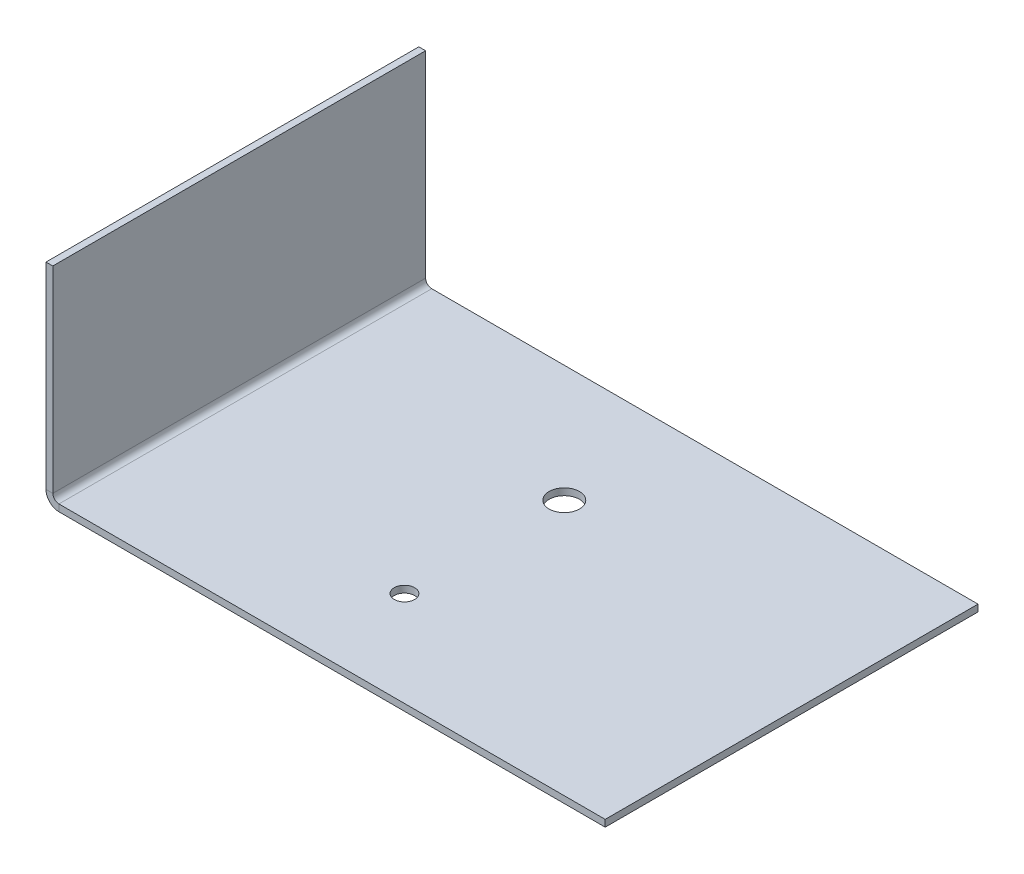
ISO-10303-21;
HEADER;
FILE_DESCRIPTION(('STEP AP214'),'2;1');
FILE_NAME('part.step','',(''),(''),'','','');
FILE_SCHEMA(('AUTOMOTIVE_DESIGN { 1 0 10303 214 1 1 1 1 }'));
ENDSEC;
DATA;
#1=APPLICATION_CONTEXT('core data for automotive mechanical design processes');
#2=APPLICATION_PROTOCOL_DEFINITION('international standard','automotive_design',2000,#1);
#3=PRODUCT_CONTEXT('',#1,'mechanical');
#4=PRODUCT('Part','Part','',(#3));
#5=PRODUCT_RELATED_PRODUCT_CATEGORY('part','',(#4));
#6=PRODUCT_DEFINITION_FORMATION('','',#4);
#7=PRODUCT_DEFINITION_CONTEXT('part definition',#1,'design');
#8=PRODUCT_DEFINITION('design','',#6,#7);
#9=PRODUCT_DEFINITION_SHAPE('','',#8);
#10=(LENGTH_UNIT() NAMED_UNIT(*) SI_UNIT(.MILLI.,.METRE.));
#11=(NAMED_UNIT(*) PLANE_ANGLE_UNIT() SI_UNIT($,.RADIAN.));
#12=(NAMED_UNIT(*) SI_UNIT($,.STERADIAN.) SOLID_ANGLE_UNIT());
#13=UNCERTAINTY_MEASURE_WITH_UNIT(LENGTH_MEASURE(1.E-05),#10,'distance_accuracy_value','');
#14=(GEOMETRIC_REPRESENTATION_CONTEXT(3) GLOBAL_UNCERTAINTY_ASSIGNED_CONTEXT((#13)) GLOBAL_UNIT_ASSIGNED_CONTEXT((#10,
#11,#12)) REPRESENTATION_CONTEXT('',''));
#15=CARTESIAN_POINT('',(0.,0.,0.));
#16=DIRECTION('',(0.,0.,1.));
#17=DIRECTION('',(1.,0.,0.));
#18=AXIS2_PLACEMENT_3D('',#15,#16,#17);
#19=CARTESIAN_POINT('',(0.,-1.8542,0.));
#20=DIRECTION('',(0.,0.,1.));
#21=DIRECTION('',(1.,0.,0.));
#22=AXIS2_PLACEMENT_3D('',#19,#20,#21);
#23=PLANE('',#22);
#24=DIRECTION('',(1.,0.,0.));
#25=VECTOR('',#24,1.);
#26=CARTESIAN_POINT('',(0.,0.,0.));
#27=LINE('',#26,#25);
#28=CARTESIAN_POINT('',(3.51789999999999,0.,0.));
#29=VERTEX_POINT('',#28);
#30=CARTESIAN_POINT('',(152.4,0.,0.));
#31=VERTEX_POINT('',#30);
#32=EDGE_CURVE('E105',#29,#31,#27,.T.);
#33=ORIENTED_EDGE('',*,*,#32,.F.);
#34=DIRECTION('',(0.,-1.,0.));
#35=VECTOR('',#34,1.);
#36=CARTESIAN_POINT('',(3.51789999999999,0.,0.));
#37=LINE('',#36,#35);
#38=CARTESIAN_POINT('',(3.51789999999999,-1.8542,0.));
#39=VERTEX_POINT('',#38);
#40=EDGE_CURVE('E118',#29,#39,#37,.T.);
#41=ORIENTED_EDGE('',*,*,#40,.T.);
#42=DIRECTION('',(1.,0.,0.));
#43=VECTOR('',#42,1.);
#44=CARTESIAN_POINT('',(0.,-1.8542,0.));
#45=LINE('',#44,#43);
#46=CARTESIAN_POINT('',(152.4,-1.8542,0.));
#47=VERTEX_POINT('',#46);
#48=EDGE_CURVE('E110',#39,#47,#45,.T.);
#49=ORIENTED_EDGE('',*,*,#48,.T.);
#50=DIRECTION('',(0.,1.,0.));
#51=VECTOR('',#50,1.);
#52=CARTESIAN_POINT('',(152.4,-1.8542,0.));
#53=LINE('',#52,#51);
#54=EDGE_CURVE('E60',#47,#31,#53,.T.);
#55=ORIENTED_EDGE('',*,*,#54,.T.);
#56=EDGE_LOOP('',(#33,#41,#49,#55));
#57=FACE_BOUND('',#56,.T.);
#58=ADVANCED_FACE('F57',(#57),#23,.T.);
#59=CARTESIAN_POINT('',(0.,-1.8542,0.));
#60=DIRECTION('',(0.,-1.,0.));
#61=DIRECTION('',(0.,0.,-1.));
#62=AXIS2_PLACEMENT_3D('',#59,#60,#61);
#63=PLANE('',#62);
#64=CARTESIAN_POINT('',(71.5155165915462,-1.8542,-69.7384503067724));
#65=DIRECTION('',(0.,1.,0.));
#66=DIRECTION('',(0.,0.,1.));
#67=AXIS2_PLACEMENT_3D('',#64,#65,#66);
#68=CIRCLE('',#67,4.14137650019472);
#69=CARTESIAN_POINT('',(71.5155165915462,-1.8542,-65.5970738065777));
#70=VERTEX_POINT('',#69);
#71=EDGE_CURVE('E179',#70,#70,#68,.T.);
#72=ORIENTED_EDGE('',*,*,#71,.T.);
#73=EDGE_LOOP('',(#72));
#74=FACE_BOUND('',#73,.T.);
#75=CARTESIAN_POINT('',(71.7639107741093,-1.8542,-25.927752689995));
#76=DIRECTION('',(0.,-1.,0.));
#77=DIRECTION('',(0.,0.,-1.));
#78=AXIS2_PLACEMENT_3D('',#75,#76,#77);
#79=CIRCLE('',#78,2.7813);
#80=CARTESIAN_POINT('',(71.7639107741093,-1.8542,-28.709052689995));
#81=VERTEX_POINT('',#80);
#82=EDGE_CURVE('E143',#81,#81,#79,.T.);
#83=ORIENTED_EDGE('',*,*,#82,.F.);
#84=EDGE_LOOP('',(#83));
#85=FACE_BOUND('',#84,.T.);
#86=ORIENTED_EDGE('',*,*,#48,.F.);
#87=DIRECTION('',(0.,0.,1.));
#88=VECTOR('',#87,1.);
#89=CARTESIAN_POINT('',(3.51789999999999,-1.8542,0.));
#90=LINE('',#89,#88);
#91=CARTESIAN_POINT('',(3.51789999999999,-1.8542,-101.6));
#92=VERTEX_POINT('',#91);
#93=EDGE_CURVE('E135',#39,#92,#90,.F.);
#94=ORIENTED_EDGE('',*,*,#93,.T.);
#95=DIRECTION('',(-1.,0.,0.));
#96=VECTOR('',#95,1.);
#97=CARTESIAN_POINT('',(0.,-1.8542,-101.6));
#98=LINE('',#97,#96);
#99=CARTESIAN_POINT('',(152.4,-1.8542,-101.6));
#100=VERTEX_POINT('',#99);
#101=EDGE_CURVE('E115',#100,#92,#98,.T.);
#102=ORIENTED_EDGE('',*,*,#101,.F.);
#103=DIRECTION('',(0.,0.,-1.));
#104=VECTOR('',#103,1.);
#105=CARTESIAN_POINT('',(152.4,-1.8542,0.));
#106=LINE('',#105,#104);
#107=EDGE_CURVE('E95',#47,#100,#106,.T.);
#108=ORIENTED_EDGE('',*,*,#107,.F.);
#109=EDGE_LOOP('',(#86,#94,#102,#108));
#110=FACE_BOUND('',#109,.T.);
#111=ADVANCED_FACE('F186',(#74,#85,#110),#63,.T.);
#112=CARTESIAN_POINT('',(0.,0.,0.));
#113=DIRECTION('',(0.,-1.,0.));
#114=DIRECTION('',(0.,0.,-1.));
#115=AXIS2_PLACEMENT_3D('',#112,#113,#114);
#116=PLANE('',#115);
#117=CARTESIAN_POINT('',(71.5155165915462,0.,-69.7384503067724));
#118=DIRECTION('',(0.,1.,0.));
#119=DIRECTION('',(0.,0.,1.));
#120=AXIS2_PLACEMENT_3D('',#117,#118,#119);
#121=CIRCLE('',#120,4.14137650019472);
#122=CARTESIAN_POINT('',(71.5155165915462,0.,-65.5970738065777));
#123=VERTEX_POINT('',#122);
#124=EDGE_CURVE('E180',#123,#123,#121,.T.);
#125=ORIENTED_EDGE('',*,*,#124,.F.);
#126=EDGE_LOOP('',(#125));
#127=FACE_BOUND('',#126,.T.);
#128=CARTESIAN_POINT('',(71.7639107741093,0.,-25.927752689995));
#129=DIRECTION('',(0.,1.,0.));
#130=DIRECTION('',(0.,0.,1.));
#131=AXIS2_PLACEMENT_3D('',#128,#129,#130);
#132=CIRCLE('',#131,2.7813);
#133=CARTESIAN_POINT('',(71.7639107741093,0.,-23.146452689995));
#134=VERTEX_POINT('',#133);
#135=EDGE_CURVE('E176',#134,#134,#132,.T.);
#136=ORIENTED_EDGE('',*,*,#135,.F.);
#137=EDGE_LOOP('',(#136));
#138=FACE_BOUND('',#137,.T.);
#139=DIRECTION('',(0.,0.,1.));
#140=VECTOR('',#139,1.);
#141=CARTESIAN_POINT('',(3.51789999999999,0.,0.));
#142=LINE('',#141,#140);
#143=CARTESIAN_POINT('',(3.51789999999999,0.,-101.6));
#144=VERTEX_POINT('',#143);
#145=EDGE_CURVE('E125',#29,#144,#142,.F.);
#146=ORIENTED_EDGE('',*,*,#145,.F.);
#147=ORIENTED_EDGE('',*,*,#32,.T.);
#148=DIRECTION('',(0.,0.,-1.));
#149=VECTOR('',#148,1.);
#150=CARTESIAN_POINT('',(152.4,0.,0.));
#151=LINE('',#150,#149);
#152=CARTESIAN_POINT('',(152.4,0.,-101.6));
#153=VERTEX_POINT('',#152);
#154=EDGE_CURVE('E93',#31,#153,#151,.T.);
#155=ORIENTED_EDGE('',*,*,#154,.T.);
#156=DIRECTION('',(-1.,0.,0.));
#157=VECTOR('',#156,1.);
#158=CARTESIAN_POINT('',(0.,0.,-101.6));
#159=LINE('',#158,#157);
#160=EDGE_CURVE('E102',#153,#144,#159,.T.);
#161=ORIENTED_EDGE('',*,*,#160,.T.);
#162=EDGE_LOOP('',(#146,#147,#155,#161));
#163=FACE_BOUND('',#162,.T.);
#164=ADVANCED_FACE('F100',(#127,#138,#163),#116,.F.);
#165=CARTESIAN_POINT('',(0.,-1.8542,-101.6));
#166=DIRECTION('',(0.,0.,-1.));
#167=DIRECTION('',(-1.,0.,0.));
#168=AXIS2_PLACEMENT_3D('',#165,#166,#167);
#169=PLANE('',#168);
#170=DIRECTION('',(0.,-1.,0.));
#171=VECTOR('',#170,1.);
#172=CARTESIAN_POINT('',(3.51789999999999,0.,-101.6));
#173=LINE('',#172,#171);
#174=EDGE_CURVE('E109',#144,#92,#173,.T.);
#175=ORIENTED_EDGE('',*,*,#174,.F.);
#176=ORIENTED_EDGE('',*,*,#160,.F.);
#177=DIRECTION('',(0.,1.,0.));
#178=VECTOR('',#177,1.);
#179=CARTESIAN_POINT('',(152.4,-1.8542,-101.6));
#180=LINE('',#179,#178);
#181=EDGE_CURVE('E13',#100,#153,#180,.T.);
#182=ORIENTED_EDGE('',*,*,#181,.F.);
#183=ORIENTED_EDGE('',*,*,#101,.T.);
#184=EDGE_LOOP('',(#175,#176,#182,#183));
#185=FACE_BOUND('',#184,.T.);
#186=ADVANCED_FACE('F108',(#185),#169,.T.);
#187=CARTESIAN_POINT('',(152.4,-1.8542,0.));
#188=DIRECTION('',(1.,0.,0.));
#189=DIRECTION('',(0.,0.,-1.));
#190=AXIS2_PLACEMENT_3D('',#187,#188,#189);
#191=PLANE('',#190);
#192=ORIENTED_EDGE('',*,*,#154,.F.);
#193=ORIENTED_EDGE('',*,*,#54,.F.);
#194=ORIENTED_EDGE('',*,*,#107,.T.);
#195=ORIENTED_EDGE('',*,*,#181,.T.);
#196=EDGE_LOOP('',(#192,#193,#194,#195));
#197=FACE_BOUND('',#196,.T.);
#198=ADVANCED_FACE('F91',(#197),#191,.T.);
#199=CARTESIAN_POINT('',(3.51789999999999,1.6637,-101.6));
#200=DIRECTION('',(0.,0.,-1.));
#201=DIRECTION('',(-1.,0.,0.));
#202=AXIS2_PLACEMENT_3D('',#199,#200,#201);
#203=PLANE('',#202);
#204=DIRECTION('',(1.,0.,0.));
#205=VECTOR('',#204,1.);
#206=CARTESIAN_POINT('',(0.,1.66369999999999,-101.6));
#207=LINE('',#206,#205);
#208=CARTESIAN_POINT('',(1.85419999999999,1.66369999999999,-101.6));
#209=VERTEX_POINT('',#208);
#210=CARTESIAN_POINT('',(0.,1.66369999999999,-101.6));
#211=VERTEX_POINT('',#210);
#212=EDGE_CURVE('E139',#209,#211,#207,.F.);
#213=ORIENTED_EDGE('',*,*,#212,.F.);
#214=CARTESIAN_POINT('',(3.51789999999999,1.6637,-101.6));
#215=DIRECTION('',(0.,0.,1.));
#216=DIRECTION('',(1.,0.,0.));
#217=AXIS2_PLACEMENT_3D('',#214,#215,#216);
#218=CIRCLE('',#217,1.6637);
#219=EDGE_CURVE('E129',#144,#209,#218,.F.);
#220=ORIENTED_EDGE('',*,*,#219,.F.);
#221=ORIENTED_EDGE('',*,*,#174,.T.);
#222=CARTESIAN_POINT('',(3.51789999999999,1.6637,-101.6));
#223=DIRECTION('',(0.,0.,1.));
#224=DIRECTION('',(1.,0.,0.));
#225=AXIS2_PLACEMENT_3D('',#222,#223,#224);
#226=CIRCLE('',#225,3.5179);
#227=EDGE_CURVE('E71',#92,#211,#226,.F.);
#228=ORIENTED_EDGE('',*,*,#227,.T.);
#229=EDGE_LOOP('',(#213,#220,#221,#228));
#230=FACE_BOUND('',#229,.T.);
#231=ADVANCED_FACE('F268',(#230),#203,.T.);
#232=CARTESIAN_POINT('',(3.51789999999999,1.6637,0.));
#233=DIRECTION('',(0.,0.,-1.));
#234=DIRECTION('',(-1.,0.,0.));
#235=AXIS2_PLACEMENT_3D('',#232,#233,#234);
#236=PLANE('',#235);
#237=CARTESIAN_POINT('',(3.51789999999999,1.6637,0.));
#238=DIRECTION('',(0.,0.,1.));
#239=DIRECTION('',(1.,0.,0.));
#240=AXIS2_PLACEMENT_3D('',#237,#238,#239);
#241=CIRCLE('',#240,1.6637);
#242=CARTESIAN_POINT('',(1.85419999999999,1.66369999999999,0.));
#243=VERTEX_POINT('',#242);
#244=EDGE_CURVE('E122',#243,#29,#241,.T.);
#245=ORIENTED_EDGE('',*,*,#244,.F.);
#246=DIRECTION('',(1.,0.,0.));
#247=VECTOR('',#246,1.);
#248=CARTESIAN_POINT('',(1.85419999999999,1.66369999999999,0.));
#249=LINE('',#248,#247);
#250=CARTESIAN_POINT('',(0.,1.66369999999999,0.));
#251=VERTEX_POINT('',#250);
#252=EDGE_CURVE('E146',#243,#251,#249,.F.);
#253=ORIENTED_EDGE('',*,*,#252,.T.);
#254=CARTESIAN_POINT('',(3.51789999999999,1.6637,0.));
#255=DIRECTION('',(0.,0.,1.));
#256=DIRECTION('',(1.,0.,0.));
#257=AXIS2_PLACEMENT_3D('',#254,#255,#256);
#258=CIRCLE('',#257,3.5179);
#259=EDGE_CURVE('E132',#251,#39,#258,.T.);
#260=ORIENTED_EDGE('',*,*,#259,.T.);
#261=ORIENTED_EDGE('',*,*,#40,.F.);
#262=EDGE_LOOP('',(#245,#253,#260,#261));
#263=FACE_BOUND('',#262,.T.);
#264=ADVANCED_FACE('F250',(#263),#236,.F.);
#265=CARTESIAN_POINT('',(3.51789999999999,1.6637,0.));
#266=DIRECTION('',(0.,0.,1.));
#267=DIRECTION('',(-1.,0.,0.));
#268=AXIS2_PLACEMENT_3D('',#265,#266,#267);
#269=CYLINDRICAL_SURFACE('',#268,3.5179);
#270=ORIENTED_EDGE('',*,*,#93,.F.);
#271=ORIENTED_EDGE('',*,*,#259,.F.);
#272=DIRECTION('',(0.,0.,1.));
#273=VECTOR('',#272,1.);
#274=CARTESIAN_POINT('',(0.,1.66369999999999,-101.6));
#275=LINE('',#274,#273);
#276=EDGE_CURVE('E149',#251,#211,#275,.F.);
#277=ORIENTED_EDGE('',*,*,#276,.T.);
#278=ORIENTED_EDGE('',*,*,#227,.F.);
#279=EDGE_LOOP('',(#270,#271,#277,#278));
#280=FACE_BOUND('',#279,.T.);
#281=ADVANCED_FACE('F248',(#280),#269,.T.);
#282=CARTESIAN_POINT('',(3.51789999999999,1.6637,0.));
#283=DIRECTION('',(0.,0.,1.));
#284=DIRECTION('',(-1.,0.,0.));
#285=AXIS2_PLACEMENT_3D('',#282,#283,#284);
#286=CYLINDRICAL_SURFACE('',#285,1.6637);
#287=ORIENTED_EDGE('',*,*,#145,.T.);
#288=ORIENTED_EDGE('',*,*,#219,.T.);
#289=DIRECTION('',(0.,0.,1.));
#290=VECTOR('',#289,1.);
#291=CARTESIAN_POINT('',(1.85419999999999,1.66369999999999,-101.6));
#292=LINE('',#291,#290);
#293=EDGE_CURVE('E142',#209,#243,#292,.T.);
#294=ORIENTED_EDGE('',*,*,#293,.T.);
#295=ORIENTED_EDGE('',*,*,#244,.T.);
#296=EDGE_LOOP('',(#287,#288,#294,#295));
#297=FACE_BOUND('',#296,.T.);
#298=ADVANCED_FACE('F267',(#297),#286,.F.);
#299=CARTESIAN_POINT('',(0.,0.,-101.6));
#300=DIRECTION('',(0.,0.,1.));
#301=DIRECTION('',(1.,0.,0.));
#302=AXIS2_PLACEMENT_3D('',#299,#300,#301);
#303=PLANE('',#302);
#304=ORIENTED_EDGE('',*,*,#212,.T.);
#305=DIRECTION('',(0.,-1.,0.));
#306=VECTOR('',#305,1.);
#307=CARTESIAN_POINT('',(0.,0.,-101.6));
#308=LINE('',#307,#306);
#309=CARTESIAN_POINT('',(-1.93197279255412E-13,55.3339,-101.6));
#310=VERTEX_POINT('',#309);
#311=EDGE_CURVE('E160',#310,#211,#308,.T.);
#312=ORIENTED_EDGE('',*,*,#311,.F.);
#313=DIRECTION('',(1.,0.,0.));
#314=VECTOR('',#313,1.);
#315=CARTESIAN_POINT('',(-1.93197279255412E-13,55.3339,-101.6));
#316=LINE('',#315,#314);
#317=CARTESIAN_POINT('',(1.85419999999981,55.3339,-101.6));
#318=VERTEX_POINT('',#317);
#319=EDGE_CURVE('E169',#310,#318,#316,.T.);
#320=ORIENTED_EDGE('',*,*,#319,.T.);
#321=DIRECTION('',(0.,1.,0.));
#322=VECTOR('',#321,1.);
#323=CARTESIAN_POINT('',(1.8542,0.,-101.6));
#324=LINE('',#323,#322);
#325=EDGE_CURVE('E151',#318,#209,#324,.F.);
#326=ORIENTED_EDGE('',*,*,#325,.T.);
#327=EDGE_LOOP('',(#304,#312,#320,#326));
#328=FACE_BOUND('',#327,.T.);
#329=ADVANCED_FACE('F263',(#328),#303,.F.);
#330=CARTESIAN_POINT('',(-1.93204827136917E-13,55.3339,0.));
#331=DIRECTION('',(0.,0.,-1.));
#332=DIRECTION('',(-1.,0.,0.));
#333=AXIS2_PLACEMENT_3D('',#330,#331,#332);
#334=PLANE('',#333);
#335=ORIENTED_EDGE('',*,*,#252,.F.);
#336=DIRECTION('',(0.,-1.,0.));
#337=VECTOR('',#336,1.);
#338=CARTESIAN_POINT('',(1.85419999999981,55.3339,0.));
#339=LINE('',#338,#337);
#340=CARTESIAN_POINT('',(1.85419999999981,55.3339,0.));
#341=VERTEX_POINT('',#340);
#342=EDGE_CURVE('E154',#243,#341,#339,.F.);
#343=ORIENTED_EDGE('',*,*,#342,.T.);
#344=DIRECTION('',(1.,0.,0.));
#345=VECTOR('',#344,1.);
#346=CARTESIAN_POINT('',(-1.93204827136917E-13,55.3339,0.));
#347=LINE('',#346,#345);
#348=CARTESIAN_POINT('',(-1.93197279255412E-13,55.3339,0.));
#349=VERTEX_POINT('',#348);
#350=EDGE_CURVE('E126',#349,#341,#347,.T.);
#351=ORIENTED_EDGE('',*,*,#350,.F.);
#352=DIRECTION('',(0.,1.,0.));
#353=VECTOR('',#352,1.);
#354=CARTESIAN_POINT('',(0.,0.,0.));
#355=LINE('',#354,#353);
#356=EDGE_CURVE('E163',#251,#349,#355,.T.);
#357=ORIENTED_EDGE('',*,*,#356,.F.);
#358=EDGE_LOOP('',(#335,#343,#351,#357));
#359=FACE_BOUND('',#358,.T.);
#360=ADVANCED_FACE('F259',(#359),#334,.F.);
#361=CARTESIAN_POINT('',(0.,0.,0.));
#362=DIRECTION('',(1.,0.,0.));
#363=DIRECTION('',(0.,1.,0.));
#364=AXIS2_PLACEMENT_3D('',#361,#362,#363);
#365=PLANE('',#364);
#366=ORIENTED_EDGE('',*,*,#276,.F.);
#367=ORIENTED_EDGE('',*,*,#356,.T.);
#368=DIRECTION('',(0.,0.,-1.));
#369=VECTOR('',#368,1.);
#370=CARTESIAN_POINT('',(-1.93197279255412E-13,55.3339,0.));
#371=LINE('',#370,#369);
#372=EDGE_CURVE('E166',#349,#310,#371,.T.);
#373=ORIENTED_EDGE('',*,*,#372,.T.);
#374=ORIENTED_EDGE('',*,*,#311,.T.);
#375=EDGE_LOOP('',(#366,#367,#373,#374));
#376=FACE_BOUND('',#375,.T.);
#377=ADVANCED_FACE('F256',(#376),#365,.F.);
#378=CARTESIAN_POINT('',(1.8542,0.,0.));
#379=DIRECTION('',(1.,0.,0.));
#380=DIRECTION('',(0.,1.,0.));
#381=AXIS2_PLACEMENT_3D('',#378,#379,#380);
#382=PLANE('',#381);
#383=ORIENTED_EDGE('',*,*,#342,.F.);
#384=ORIENTED_EDGE('',*,*,#293,.F.);
#385=ORIENTED_EDGE('',*,*,#325,.F.);
#386=DIRECTION('',(0.,0.,1.));
#387=VECTOR('',#386,1.);
#388=CARTESIAN_POINT('',(1.85419999999981,55.3339,-101.6));
#389=LINE('',#388,#387);
#390=EDGE_CURVE('E157',#341,#318,#389,.F.);
#391=ORIENTED_EDGE('',*,*,#390,.F.);
#392=EDGE_LOOP('',(#383,#384,#385,#391));
#393=FACE_BOUND('',#392,.T.);
#394=ADVANCED_FACE('F208',(#393),#382,.T.);
#395=CARTESIAN_POINT('',(-1.93204827136917E-13,55.3339,-101.6));
#396=DIRECTION('',(0.,-1.,0.));
#397=DIRECTION('',(1.,0.,0.));
#398=AXIS2_PLACEMENT_3D('',#395,#396,#397);
#399=PLANE('',#398);
#400=ORIENTED_EDGE('',*,*,#390,.T.);
#401=ORIENTED_EDGE('',*,*,#319,.F.);
#402=ORIENTED_EDGE('',*,*,#372,.F.);
#403=ORIENTED_EDGE('',*,*,#350,.T.);
#404=EDGE_LOOP('',(#400,#401,#402,#403));
#405=FACE_BOUND('',#404,.T.);
#406=ADVANCED_FACE('F202',(#405),#399,.F.);
#407=CARTESIAN_POINT('',(71.7639107741093,-2.54,-25.927752689995));
#408=DIRECTION('',(0.,1.,0.));
#409=DIRECTION('',(0.,0.,1.));
#410=AXIS2_PLACEMENT_3D('',#407,#408,#409);
#411=CYLINDRICAL_SURFACE('',#410,2.7813);
#412=ORIENTED_EDGE('',*,*,#82,.T.);
#413=EDGE_LOOP('',(#412));
#414=FACE_BOUND('',#413,.T.);
#415=ORIENTED_EDGE('',*,*,#135,.T.);
#416=EDGE_LOOP('',(#415));
#417=FACE_BOUND('',#416,.T.);
#418=ADVANCED_FACE('F192',(#414,#417),#411,.F.);
#419=CARTESIAN_POINT('',(71.5155165915462,-1.8542,-69.7384503067724));
#420=DIRECTION('',(0.,1.,0.));
#421=DIRECTION('',(0.,0.,1.));
#422=AXIS2_PLACEMENT_3D('',#419,#420,#421);
#423=CYLINDRICAL_SURFACE('',#422,4.14137650019472);
#424=ORIENTED_EDGE('',*,*,#71,.F.);
#425=EDGE_LOOP('',(#424));
#426=FACE_BOUND('',#425,.T.);
#427=ORIENTED_EDGE('',*,*,#124,.T.);
#428=EDGE_LOOP('',(#427));
#429=FACE_BOUND('',#428,.T.);
#430=ADVANCED_FACE('F189',(#426,#429),#423,.F.);
#431=CLOSED_SHELL('',(#58,#111,#164,#186,#198,#231,#264,#281,#298,#329,#360,#377,#394,#406,#418,#430));
#432=MANIFOLD_SOLID_BREP('B2',#431);
#433=ADVANCED_BREP_SHAPE_REPRESENTATION('',(#18,#432),#14);
#434=SHAPE_DEFINITION_REPRESENTATION(#9,#433);
ENDSEC;
END-ISO-10303-21;
